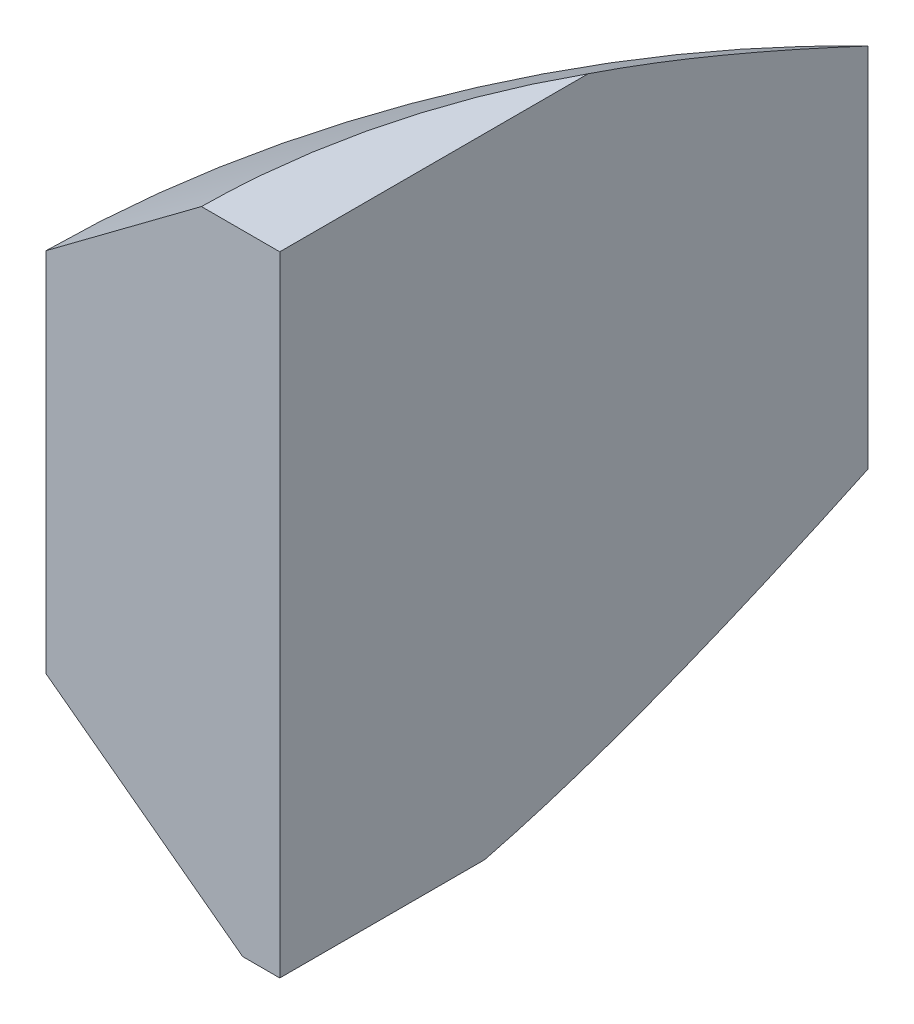
ISO-10303-21;
HEADER;
FILE_DESCRIPTION(('STEP AP214'),'2;1');
FILE_NAME('part.step','',(''),(''),'','','');
FILE_SCHEMA(('AUTOMOTIVE_DESIGN { 1 0 10303 214 1 1 1 1 }'));
ENDSEC;
DATA;
#1=APPLICATION_CONTEXT('core data for automotive mechanical design processes');
#2=APPLICATION_PROTOCOL_DEFINITION('international standard','automotive_design',2000,#1);
#3=PRODUCT_CONTEXT('',#1,'mechanical');
#4=PRODUCT('Part','Part','',(#3));
#5=PRODUCT_RELATED_PRODUCT_CATEGORY('part','',(#4));
#6=PRODUCT_DEFINITION_FORMATION('','',#4);
#7=PRODUCT_DEFINITION_CONTEXT('part definition',#1,'design');
#8=PRODUCT_DEFINITION('design','',#6,#7);
#9=PRODUCT_DEFINITION_SHAPE('','',#8);
#10=(LENGTH_UNIT() NAMED_UNIT(*) SI_UNIT(.MILLI.,.METRE.));
#11=(NAMED_UNIT(*) PLANE_ANGLE_UNIT() SI_UNIT($,.RADIAN.));
#12=(NAMED_UNIT(*) SI_UNIT($,.STERADIAN.) SOLID_ANGLE_UNIT());
#13=UNCERTAINTY_MEASURE_WITH_UNIT(LENGTH_MEASURE(1.E-05),#10,'distance_accuracy_value','');
#14=(GEOMETRIC_REPRESENTATION_CONTEXT(3) GLOBAL_UNCERTAINTY_ASSIGNED_CONTEXT((#13)) GLOBAL_UNIT_ASSIGNED_CONTEXT((#10,
#11,#12)) REPRESENTATION_CONTEXT('',''));
#15=CARTESIAN_POINT('',(0.,0.,0.));
#16=DIRECTION('',(0.,0.,1.));
#17=DIRECTION('',(1.,0.,0.));
#18=AXIS2_PLACEMENT_3D('',#15,#16,#17);
#19=CARTESIAN_POINT('',(-308.554799780113,77.7625120885841,-149.499973367811));
#20=DIRECTION('',(0.,1.,0.));
#21=DIRECTION('',(-1.,0.,0.));
#22=AXIS2_PLACEMENT_3D('',#19,#20,#21);
#23=PLANE('',#22);
#24=DIRECTION('',(1.,0.,0.));
#25=VECTOR('',#24,1.);
#26=CARTESIAN_POINT('',(-308.554799780113,77.7625120885841,-150.));
#27=LINE('',#26,#25);
#28=CARTESIAN_POINT('',(-308.553136985618,77.7625120885841,-150.));
#29=VERTEX_POINT('',#28);
#30=CARTESIAN_POINT('',(-300.,77.7625120885841,-149.999999999977));
#31=VERTEX_POINT('',#30);
#32=EDGE_CURVE('E190',#29,#31,#27,.T.);
#33=ORIENTED_EDGE('',*,*,#32,.T.);
#34=DIRECTION('',(0.,0.,-1.));
#35=VECTOR('',#34,1.);
#36=CARTESIAN_POINT('',(-300.,77.7625120885841,-149.499973367811));
#37=LINE('',#36,#35);
#38=CARTESIAN_POINT('',(-300.,77.7625120885841,-183.659581031771));
#39=VERTEX_POINT('',#38);
#40=EDGE_CURVE('E60',#31,#39,#37,.T.);
#41=ORIENTED_EDGE('',*,*,#40,.T.);
#42=CARTESIAN_POINT('',(-262.506364446809,77.7625120885841,-208.339640738144));
#43=CARTESIAN_POINT('',(-289.480913338998,77.7625120885841,-208.339640738144));
#44=CARTESIAN_POINT('',(-308.554799780113,77.7625120885841,-183.96745250783));
#45=CARTESIAN_POINT('',(-308.554799780113,77.7625120885841,-149.499973367811));
#46=(BOUNDED_CURVE() B_SPLINE_CURVE(3,(#42,#43,#44,#45),.UNSPECIFIED.,.F.,
.F.) B_SPLINE_CURVE_WITH_KNOTS((4,4),(0.,1.),
.UNSPECIFIED.) CURVE() GEOMETRIC_REPRESENTATION_ITEM() RATIONAL_B_SPLINE_CURVE((1.,
0.804737854124365,0.804737854124365,1.)) REPRESENTATION_ITEM(''));
#47=EDGE_CURVE('E93',#39,#29,#46,.T.);
#48=ORIENTED_EDGE('',*,*,#47,.T.);
#49=EDGE_LOOP('',(#33,#41,#48));
#50=FACE_BOUND('',#49,.T.);
#51=ADVANCED_FACE('F34',(#50),#23,.T.);
#52=CARTESIAN_POINT('',(-262.506364446809,25.118910613293,-68.9999733678111));
#53=CARTESIAN_POINT('',(-136.506364446809,25.118910613293,-68.9999733678111));
#54=CARTESIAN_POINT('',(-136.506364446809,25.118910613293,-229.999973367811));
#55=CARTESIAN_POINT('',(-262.506364446809,25.118910613293,-229.999973367811));
#56=CARTESIAN_POINT('',(-388.506364446809,25.118910613293,-229.999973367811));
#57=CARTESIAN_POINT('',(-388.506364446809,25.118910613293,-68.9999733678111));
#58=CARTESIAN_POINT('',(-262.506364446809,25.118910613293,-68.9999733678111));
#59=CARTESIAN_POINT('',(-262.506364446809,9.11891061329303,-96.4103059974783));
#60=CARTESIAN_POINT('',(-179.409493780201,9.11891061329302,-96.4103059974782));
#61=CARTESIAN_POINT('',(-179.409493780201,9.11891061329303,-202.589640738144));
#62=CARTESIAN_POINT('',(-262.506364446809,9.11891061329303,-202.589640738144));
#63=CARTESIAN_POINT('',(-345.603235113417,9.11891061329302,-202.589640738144));
#64=CARTESIAN_POINT('',(-345.603235113417,9.11891061329302,-96.4103059974783));
#65=CARTESIAN_POINT('',(-262.506364446809,9.11891061329303,-96.4103059974783));
#66=(BOUNDED_SURFACE() B_SPLINE_SURFACE(1,3,((#52,#53,#54,#55,#56,#57,#58),(#59,#60,#61,#62,#63,
#64,#65)),.UNSPECIFIED.,.F.,.T.,.F.) B_SPLINE_SURFACE_WITH_KNOTS((2,2),(4,3,4),(0.,1.),(0.,0.5,
1.),.UNSPECIFIED.) GEOMETRIC_REPRESENTATION_ITEM() RATIONAL_B_SPLINE_SURFACE(((1.,
0.333333333333333,0.333333333333333,1.,0.333333333333333,0.333333333333333,1.),(1.,
0.333333333333333,0.333333333333333,1.,0.333333333333333,0.333333333333333,1.))) REPRESENTATION_ITEM('') SURFACE());
#67=CARTESIAN_POINT('',(-304.052956885192,9.11891061329304,-150.));
#68=CARTESIAN_POINT('',(-307.628340446863,11.7855528822422,-150.));
#69=CARTESIAN_POINT('',(-311.203712055111,14.4522111779688,-150.));
#70=CARTESIAN_POINT('',(-316.566757961196,18.4522140488977,-150.));
#71=CARTESIAN_POINT('',(-318.354438012211,19.785550910457,-150.));
#72=CARTESIAN_POINT('',(-321.929795349428,22.4522283405305,-150.));
#73=CARTESIAN_POINT('',(-323.717472635628,23.7855689090447,-150.));
#74=CARTESIAN_POINT('',(-325.505149074732,25.118910613293,-150.));
#75=B_SPLINE_CURVE_WITH_KNOTS('',3,(#67,#68,#69,#70,#71,#72,#73,#74),.UNSPECIFIED.,.F.,.F.,(4,2,
2,4),(0.,13.3809243861647,20.0713865795136,26.7618487728941),.UNSPECIFIED.);
#76=CARTESIAN_POINT('',(-304.052956885192,9.11891061329304,-150.));
#77=VERTEX_POINT('',#76);
#78=CARTESIAN_POINT('',(-325.505149074732,25.118910613293,-150.));
#79=VERTEX_POINT('',#78);
#80=EDGE_CURVE('E92',#77,#79,#75,.T.);
#81=CARTESIAN_POINT('',(-262.506364446809,25.118910613293,-229.999973367811));
#82=CARTESIAN_POINT('',(-299.410910017304,25.118910613293,-229.999973367811));
#83=CARTESIAN_POINT('',(-325.506364446809,25.118910613293,-196.655781596777));
#84=CARTESIAN_POINT('',(-325.506364446809,25.118910613293,-149.499973367811));
#85=(BOUNDED_CURVE() B_SPLINE_CURVE(3,(#81,#82,#83,#84),.UNSPECIFIED.,.F.,
.F.) B_SPLINE_CURVE_WITH_KNOTS((4,4),(0.,1.),
.UNSPECIFIED.) CURVE() GEOMETRIC_REPRESENTATION_ITEM() RATIONAL_B_SPLINE_CURVE((1.,
0.804737854124365,0.804737854124365,1.)) REPRESENTATION_ITEM(''));
#86=CARTESIAN_POINT('',(-300.,25.118910613293,-214.191721987742));
#87=VERTEX_POINT('',#86);
#88=EDGE_CURVE('E96',#87,#79,#85,.T.);
#89=CARTESIAN_POINT('',(-300.,25.118910613293,-214.191721987742));
#90=CARTESIAN_POINT('',(-300.,24.8041801312262,-213.520779730799));
#91=CARTESIAN_POINT('',(-300.,24.4908647909483,-212.84917240564));
#92=CARTESIAN_POINT('',(-300.,23.8672760024611,-211.504534463612));
#93=CARTESIAN_POINT('',(-300.,23.557002601907,-210.831503824646));
#94=CARTESIAN_POINT('',(-300.,22.9397179104042,-209.483944354385));
#95=CARTESIAN_POINT('',(-300.,22.632706632672,-208.809415517034));
#96=CARTESIAN_POINT('',(-300.,22.0220166462799,-207.45839269275));
#97=CARTESIAN_POINT('',(-300.,21.7183399132492,-206.781897812562));
#98=CARTESIAN_POINT('',(-300.,21.1147577516216,-205.427229363831));
#99=CARTESIAN_POINT('',(-300.,20.8148523115964,-204.749055800382));
#100=CARTESIAN_POINT('',(-300.,20.2190983475308,-203.390926986662));
#101=CARTESIAN_POINT('',(-300.,19.9232498346193,-202.710971731509));
#102=CARTESIAN_POINT('',(-300.,19.1890513725851,-201.008641670803));
#103=CARTESIAN_POINT('',(-300.,18.7534315119038,-199.985087017534));
#104=CARTESIAN_POINT('',(-300.,17.893199835153,-197.933368990568));
#105=CARTESIAN_POINT('',(-300.,17.468587922354,-196.905205657462));
#106=CARTESIAN_POINT('',(-300.,16.6318589233325,-194.844217420459));
#107=CARTESIAN_POINT('',(-300.,16.2197375431437,-193.811394262063));
#108=CARTESIAN_POINT('',(-300.,15.4093518088096,-191.740273750682));
#109=CARTESIAN_POINT('',(-300.,15.0110879549621,-190.701976201609));
#110=CARTESIAN_POINT('',(-300.,14.2668282591192,-188.717248748675));
#111=CARTESIAN_POINT('',(-300.,13.9194351432028,-187.7713433139));
#112=CARTESIAN_POINT('',(-300.,13.238941083907,-185.874410467796));
#113=CARTESIAN_POINT('',(-300.,12.9058399551641,-184.923383123077));
#114=CARTESIAN_POINT('',(-300.,12.2555778858956,-183.015962839192));
#115=CARTESIAN_POINT('',(-300.,11.9384157641036,-182.059570303506));
#116=CARTESIAN_POINT('',(-300.,11.3214346418529,-180.139911213063));
#117=CARTESIAN_POINT('',(-300.,11.0216372442761,-179.176637702464));
#118=CARTESIAN_POINT('',(-300.,10.4417577026157,-177.244071132216));
#119=CARTESIAN_POINT('',(-300.,10.1616771055905,-176.274777606691));
#120=CARTESIAN_POINT('',(-300.,9.62334528932077,-174.329819640564));
#121=CARTESIAN_POINT('',(-300.,9.36510113062625,-173.354153248386));
#122=CARTESIAN_POINT('',(-300.,9.11891061329303,-172.37539950585));
#123=B_SPLINE_CURVE_WITH_KNOTS('',3,(#89,#90,#91,#92,#93,#94,#95,#96,#97,#98,#99,#100,#101,#102,
#103,#104,#105,#106,#107,#108,#109,#110,#111,#112,#113,#114,#115,#116,#117,#118,#119,#120,#121,
#122),.UNSPECIFIED.,.F.,.F.,(4,2,2,2,2,2,2,2,2,2,2,2,2,2,2,2,4),(0.,2.22327891813409,
4.44659261089789,6.66991530801314,8.89449099290367,11.1190599350365,13.3436349784279,
16.6807684424738,20.0178725723907,23.353816159025,26.6898800583827,29.7128185149026,
32.7357177528233,35.7583926272595,38.7847505283424,41.8113456253906,44.8389156230268),.UNSPECIFIED.);
#124=CARTESIAN_POINT('',(-300.,9.11891061329305,-172.37539950585));
#125=VERTEX_POINT('',#124);
#126=EDGE_CURVE('E84',#87,#125,#123,.T.);
#127=CARTESIAN_POINT('',(-262.506364446809,9.11891061329305,-202.589640738144));
#128=CARTESIAN_POINT('',(-286.844874369677,9.11891061329304,-202.589640738144));
#129=CARTESIAN_POINT('',(-304.054799780113,9.11891061329305,-180.599180491476));
#130=CARTESIAN_POINT('',(-304.054799780113,9.11891061329306,-149.499973367811));
#131=(BOUNDED_CURVE() B_SPLINE_CURVE(3,(#127,#128,#129,#130),.UNSPECIFIED.,.F.,
.F.) B_SPLINE_CURVE_WITH_KNOTS((4,4),(0.,1.),
.UNSPECIFIED.) CURVE() GEOMETRIC_REPRESENTATION_ITEM() RATIONAL_B_SPLINE_CURVE((1.,
0.804737854124365,0.804737854124365,1.)) REPRESENTATION_ITEM(''));
#132=EDGE_CURVE('E38',#125,#77,#131,.T.);
#133=ORIENTED_EDGE('',*,*,#80,.T.);
#134=ORIENTED_EDGE('',*,*,#88,.F.);
#135=ORIENTED_EDGE('',*,*,#126,.T.);
#136=ORIENTED_EDGE('',*,*,#132,.T.);
#137=EDGE_LOOP('',(#133,#134,#135,#136));
#138=FACE_BOUND('',#137,.T.);
#139=ADVANCED_FACE('F97',(#138),#66,.T.);
#140=CARTESIAN_POINT('',(-304.054799780113,9.11891061329306,-149.499973367811));
#141=DIRECTION('',(0.,-1.,0.));
#142=DIRECTION('',(1.,0.,0.));
#143=AXIS2_PLACEMENT_3D('',#140,#141,#142);
#144=PLANE('',#143);
#145=DIRECTION('',(-1.,0.,0.));
#146=VECTOR('',#145,1.);
#147=CARTESIAN_POINT('',(-304.054799780113,9.11891061329306,-150.));
#148=LINE('',#147,#146);
#149=CARTESIAN_POINT('',(-300.,9.11891061329304,-149.999999999977));
#150=VERTEX_POINT('',#149);
#151=EDGE_CURVE('E45',#150,#77,#148,.T.);
#152=ORIENTED_EDGE('',*,*,#151,.T.);
#153=ORIENTED_EDGE('',*,*,#132,.F.);
#154=DIRECTION('',(0.,0.,1.));
#155=VECTOR('',#154,1.);
#156=CARTESIAN_POINT('',(-300.,9.11891061329306,-149.499973367811));
#157=LINE('',#156,#155);
#158=EDGE_CURVE('E53',#125,#150,#157,.T.);
#159=ORIENTED_EDGE('',*,*,#158,.T.);
#160=EDGE_LOOP('',(#152,#153,#159));
#161=FACE_BOUND('',#160,.T.);
#162=ADVANCED_FACE('F36',(#161),#144,.T.);
#163=CARTESIAN_POINT('',(-262.506364446809,9.11891061329304,-68.9999733678111));
#164=CARTESIAN_POINT('',(-136.506364446809,9.11891061329305,-68.9999733678111));
#165=CARTESIAN_POINT('',(-136.506364446809,9.11891061329305,-229.999973367811));
#166=CARTESIAN_POINT('',(-262.506364446809,9.11891061329304,-229.999973367811));
#167=CARTESIAN_POINT('',(-388.506364446809,9.11891061329304,-229.999973367811));
#168=CARTESIAN_POINT('',(-388.506364446809,9.11891061329304,-68.9999733678111));
#169=CARTESIAN_POINT('',(-262.506364446809,9.11891061329304,-68.9999733678111));
#170=(BOUNDED_CURVE() B_SPLINE_CURVE(3,(#163,#164,#165,#166,#167,#168,#169),.UNSPECIFIED.,.T.,
.F.) B_SPLINE_CURVE_WITH_KNOTS((4,3,4),(0.,0.5,1.),
.UNSPECIFIED.) CURVE() GEOMETRIC_REPRESENTATION_ITEM() RATIONAL_B_SPLINE_CURVE((1.,
0.333333333333333,0.333333333333333,1.,0.333333333333333,0.333333333333333,1.)) REPRESENTATION_ITEM(''));
#171=DIRECTION('',(0.,1.,0.));
#172=VECTOR('',#171,1.);
#173=SURFACE_OF_LINEAR_EXTRUSION('',#170,#172);
#174=DIRECTION('',(0.,1.,0.));
#175=VECTOR('',#174,1.);
#176=CARTESIAN_POINT('',(-325.505149074732,45.118910613293,-150.));
#177=LINE('',#176,#175);
#178=CARTESIAN_POINT('',(-325.505149074732,65.1189106132931,-150.));
#179=VERTEX_POINT('',#178);
#180=EDGE_CURVE('E104',#79,#179,#177,.T.);
#181=ORIENTED_EDGE('',*,*,#180,.T.);
#182=CARTESIAN_POINT('',(-262.506364446809,65.1189106132931,-229.999973367811));
#183=CARTESIAN_POINT('',(-299.410910017304,65.1189106132931,-229.999973367811));
#184=CARTESIAN_POINT('',(-325.506364446809,65.1189106132931,-196.655781596777));
#185=CARTESIAN_POINT('',(-325.506364446809,65.1189106132931,-149.499973367811));
#186=(BOUNDED_CURVE() B_SPLINE_CURVE(3,(#182,#183,#184,#185),.UNSPECIFIED.,.F.,
.F.) B_SPLINE_CURVE_WITH_KNOTS((4,4),(0.,1.),
.UNSPECIFIED.) CURVE() GEOMETRIC_REPRESENTATION_ITEM() RATIONAL_B_SPLINE_CURVE((1.,
0.804737854124365,0.804737854124365,1.)) REPRESENTATION_ITEM(''));
#187=CARTESIAN_POINT('',(-300.,65.1189106132931,-214.191721987742));
#188=VERTEX_POINT('',#187);
#189=EDGE_CURVE('E100',#188,#179,#186,.T.);
#190=ORIENTED_EDGE('',*,*,#189,.F.);
#191=DIRECTION('',(0.,1.,0.));
#192=VECTOR('',#191,1.);
#193=CARTESIAN_POINT('',(-300.,45.118910613293,-214.191721987742));
#194=LINE('',#193,#192);
#195=EDGE_CURVE('E88',#188,#87,#194,.F.);
#196=ORIENTED_EDGE('',*,*,#195,.T.);
#197=ORIENTED_EDGE('',*,*,#88,.T.);
#198=EDGE_LOOP('',(#181,#190,#196,#197));
#199=FACE_BOUND('',#198,.T.);
#200=ADVANCED_FACE('F101',(#199),#173,.T.);
#201=CARTESIAN_POINT('',(-262.506364446809,65.1189106132931,-229.999973367811));
#202=CARTESIAN_POINT('',(-136.506364446809,65.1189106132931,-229.999973367811));
#203=CARTESIAN_POINT('',(-136.506364446809,65.1189106132931,-68.9999733678111));
#204=CARTESIAN_POINT('',(-262.506364446809,65.1189106132931,-68.999973367811));
#205=CARTESIAN_POINT('',(-388.506364446809,65.1189106132931,-68.9999733678111));
#206=CARTESIAN_POINT('',(-388.506364446809,65.1189106132931,-229.999973367811));
#207=CARTESIAN_POINT('',(-262.506364446809,65.1189106132931,-229.999973367811));
#208=CARTESIAN_POINT('',(-262.506364446809,77.7625120885841,-208.339640738144));
#209=CARTESIAN_POINT('',(-170.409493780201,77.7625120885842,-208.339640738144));
#210=CARTESIAN_POINT('',(-170.409493780201,77.7625120885842,-90.6603059974782));
#211=CARTESIAN_POINT('',(-262.506364446809,77.7625120885841,-90.6603059974782));
#212=CARTESIAN_POINT('',(-354.603235113417,77.7625120885841,-90.6603059974782));
#213=CARTESIAN_POINT('',(-354.603235113417,77.7625120885842,-208.339640738144));
#214=CARTESIAN_POINT('',(-262.506364446809,77.7625120885841,-208.339640738144));
#215=(BOUNDED_SURFACE() B_SPLINE_SURFACE(1,3,((#201,#202,#203,#204,#205,#206,#207),(#208,#209,
#210,#211,#212,#213,#214)),.UNSPECIFIED.,.F.,.T.,.F.) B_SPLINE_SURFACE_WITH_KNOTS((2,2),(4,3,4),
(0.,1.),(0.,0.5,1.),
.UNSPECIFIED.) GEOMETRIC_REPRESENTATION_ITEM() RATIONAL_B_SPLINE_SURFACE(((1.,0.333333333333333,
0.333333333333333,1.,0.333333333333333,0.333333333333333,1.),(1.,0.333333333333333,
0.333333333333333,1.,0.333333333333333,0.333333333333333,1.))) REPRESENTATION_ITEM('') SURFACE());
#216=CARTESIAN_POINT('',(-325.505149074732,65.1189106132931,-150.));
#217=CARTESIAN_POINT('',(-324.092484946622,66.1725488238386,-150.));
#218=CARTESIAN_POINT('',(-322.67982023086,67.226186246493,-150.));
#219=CARTESIAN_POINT('',(-319.85448917577,69.3334589150016,-150.));
#220=CARTESIAN_POINT('',(-318.441822836442,70.3870941608558,-150.));
#221=CARTESIAN_POINT('',(-314.203820710675,73.5479957317227,-150.));
#222=CARTESIAN_POINT('',(-311.378481816496,75.6552578900079,-150.));
#223=CARTESIAN_POINT('',(-308.553136985618,77.7625120885841,-150.));
#224=B_SPLINE_CURVE_WITH_KNOTS('',3,(#216,#217,#218,#219,#220,#221,#222,#223),.UNSPECIFIED.,.F.,
.F.,(4,2,2,4),(0.,5.28696139177814,10.5739227835569,21.1478455672744),.UNSPECIFIED.);
#225=EDGE_CURVE('E133',#179,#29,#224,.T.);
#226=CARTESIAN_POINT('',(-300.,77.7625120885841,-183.659581031771));
#227=CARTESIAN_POINT('',(-300.,77.480344939369,-184.492173449945));
#228=CARTESIAN_POINT('',(-300.,77.1920782075818,-185.322681867301));
#229=CARTESIAN_POINT('',(-300.,76.6043812242926,-186.979707576226));
#230=CARTESIAN_POINT('',(-300.,76.3049513828677,-187.806225013145));
#231=CARTESIAN_POINT('',(-300.,75.696015738575,-189.455309635366));
#232=CARTESIAN_POINT('',(-300.,75.3865123608729,-190.277877717534));
#233=CARTESIAN_POINT('',(-300.,74.7582588729162,-191.919479708375));
#234=CARTESIAN_POINT('',(-300.,74.4395086631948,-192.738513578921));
#235=CARTESIAN_POINT('',(-300.,73.4274809929911,-195.29989300887));
#236=CARTESIAN_POINT('',(-300.,72.7192702114376,-197.036349371928));
#237=CARTESIAN_POINT('',(-300.,71.2713554225955,-200.496278797821));
#238=CARTESIAN_POINT('',(-300.,70.5316474724866,-202.219750203227));
#239=CARTESIAN_POINT('',(-300.,69.4021593667882,-204.797327100897));
#240=CARTESIAN_POINT('',(-300.,69.0221261154378,-205.655721384238));
#241=CARTESIAN_POINT('',(-300.,68.256100719041,-207.369850647625));
#242=CARTESIAN_POINT('',(-300.,67.8701085605988,-208.225585621686));
#243=CARTESIAN_POINT('',(-300.,67.0927793679216,-209.934385976319));
#244=CARTESIAN_POINT('',(-300.,66.7014435766206,-210.787451922822));
#245=CARTESIAN_POINT('',(-300.,65.9137965584112,-212.491274163554));
#246=CARTESIAN_POINT('',(-300.,65.5174853802062,-213.342030480291));
#247=CARTESIAN_POINT('',(-300.,65.1189106132931,-214.191721987742));
#248=B_SPLINE_CURVE_WITH_KNOTS('',3,(#226,#227,#228,#229,#230,#231,#232,#233,#234,#235,#236,
#237,#238,#239,#240,#241,#242,#243,#244,#245,#246,#247),.UNSPECIFIED.,.F.,.F.,(4,2,2,2,2,2,2,2,
2,2,4),(0.,2.63727281120958,5.27444883744886,7.91099460259154,10.5475687391604,16.1731234434804,
21.7993844378393,24.6156387522723,27.431899398634,30.2475157763245,33.0631046136753),.UNSPECIFIED.);
#249=EDGE_CURVE('E141',#39,#188,#248,.T.);
#250=ORIENTED_EDGE('',*,*,#225,.T.);
#251=ORIENTED_EDGE('',*,*,#47,.F.);
#252=ORIENTED_EDGE('',*,*,#249,.T.);
#253=ORIENTED_EDGE('',*,*,#189,.T.);
#254=EDGE_LOOP('',(#250,#251,#252,#253));
#255=FACE_BOUND('',#254,.T.);
#256=ADVANCED_FACE('F128',(#255),#215,.T.);
#257=CARTESIAN_POINT('',(1.11022302462516E-13,0.,-150.));
#258=DIRECTION('',(0.,0.,1.));
#259=DIRECTION('',(1.,0.,0.));
#260=AXIS2_PLACEMENT_3D('',#257,#258,#259);
#261=PLANE('',#260);
#262=ORIENTED_EDGE('',*,*,#32,.F.);
#263=ORIENTED_EDGE('',*,*,#225,.F.);
#264=ORIENTED_EDGE('',*,*,#180,.F.);
#265=ORIENTED_EDGE('',*,*,#80,.F.);
#266=ORIENTED_EDGE('',*,*,#151,.F.);
#267=DIRECTION('',(0.,-1.,0.));
#268=VECTOR('',#267,1.);
#269=CARTESIAN_POINT('',(-300.,0.,-150.));
#270=LINE('',#269,#268);
#271=EDGE_CURVE('E11',#31,#150,#270,.T.);
#272=ORIENTED_EDGE('',*,*,#271,.F.);
#273=EDGE_LOOP('',(#262,#263,#264,#265,#266,#272));
#274=FACE_BOUND('',#273,.T.);
#275=ADVANCED_FACE('F125',(#274),#261,.T.);
#276=CARTESIAN_POINT('',(-300.,0.,0.));
#277=DIRECTION('',(1.,0.,0.));
#278=DIRECTION('',(0.,0.,-1.));
#279=AXIS2_PLACEMENT_3D('',#276,#277,#278);
#280=PLANE('',#279);
#281=ORIENTED_EDGE('',*,*,#40,.F.);
#282=ORIENTED_EDGE('',*,*,#271,.T.);
#283=ORIENTED_EDGE('',*,*,#158,.F.);
#284=ORIENTED_EDGE('',*,*,#126,.F.);
#285=ORIENTED_EDGE('',*,*,#195,.F.);
#286=ORIENTED_EDGE('',*,*,#249,.F.);
#287=EDGE_LOOP('',(#281,#282,#283,#284,#285,#286));
#288=FACE_BOUND('',#287,.T.);
#289=ADVANCED_FACE('F86',(#288),#280,.T.);
#290=CLOSED_SHELL('',(#51,#139,#162,#200,#256,#275,#289));
#291=MANIFOLD_SOLID_BREP('B2',#290);
#292=ADVANCED_BREP_SHAPE_REPRESENTATION('',(#18,#291),#14);
#293=SHAPE_DEFINITION_REPRESENTATION(#9,#292);
ENDSEC;
END-ISO-10303-21;
